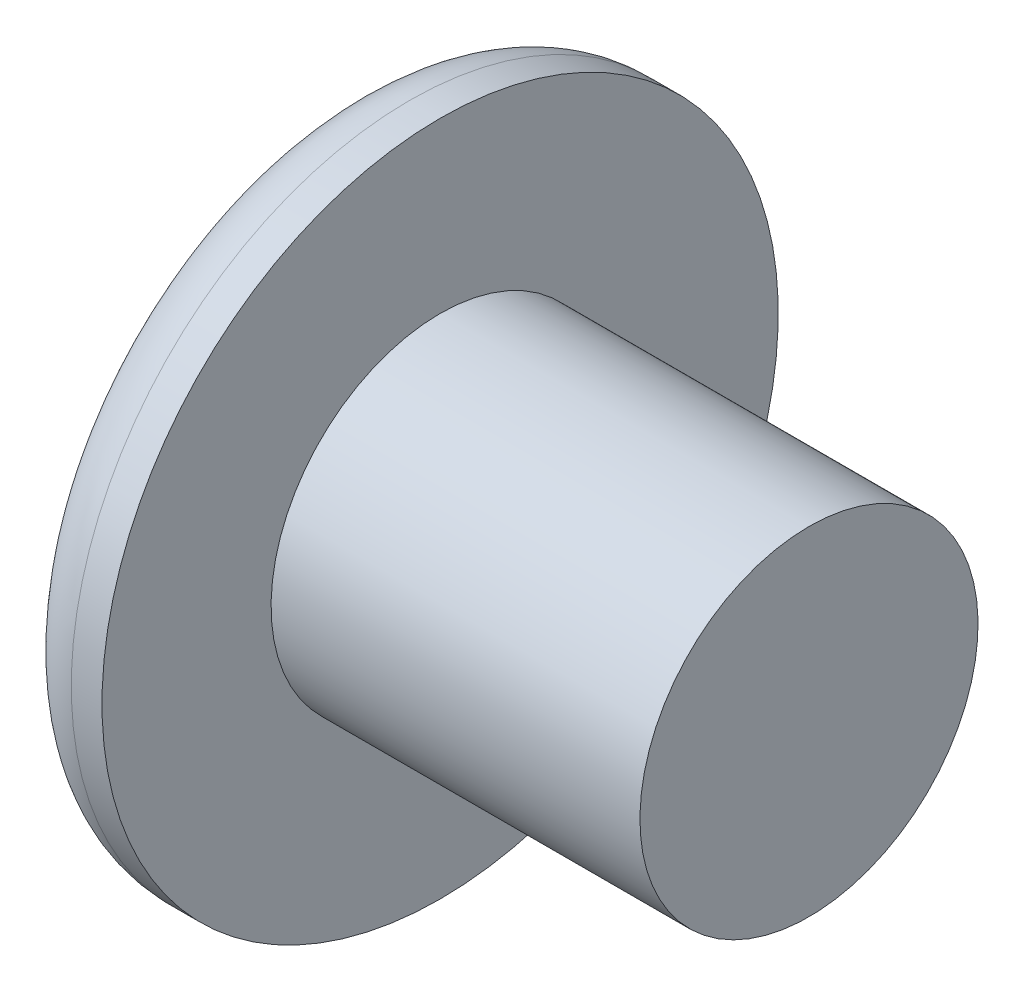
ISO-10303-21;
HEADER;
FILE_DESCRIPTION(('STEP AP214'),'2;1');
FILE_NAME('part.step','',(''),(''),'','','');
FILE_SCHEMA(('AUTOMOTIVE_DESIGN { 1 0 10303 214 1 1 1 1 }'));
ENDSEC;
DATA;
#1=APPLICATION_CONTEXT('core data for automotive mechanical design processes');
#2=APPLICATION_PROTOCOL_DEFINITION('international standard','automotive_design',2000,#1);
#3=PRODUCT_CONTEXT('',#1,'mechanical');
#4=PRODUCT('Part','Part','',(#3));
#5=PRODUCT_RELATED_PRODUCT_CATEGORY('part','',(#4));
#6=PRODUCT_DEFINITION_FORMATION('','',#4);
#7=PRODUCT_DEFINITION_CONTEXT('part definition',#1,'design');
#8=PRODUCT_DEFINITION('design','',#6,#7);
#9=PRODUCT_DEFINITION_SHAPE('','',#8);
#10=(LENGTH_UNIT() NAMED_UNIT(*) SI_UNIT(.MILLI.,.METRE.));
#11=(NAMED_UNIT(*) PLANE_ANGLE_UNIT() SI_UNIT($,.RADIAN.));
#12=(NAMED_UNIT(*) SI_UNIT($,.STERADIAN.) SOLID_ANGLE_UNIT());
#13=UNCERTAINTY_MEASURE_WITH_UNIT(LENGTH_MEASURE(1.E-05),#10,'distance_accuracy_value','');
#14=(GEOMETRIC_REPRESENTATION_CONTEXT(3) GLOBAL_UNCERTAINTY_ASSIGNED_CONTEXT((#13)) GLOBAL_UNIT_ASSIGNED_CONTEXT((#10,
#11,#12)) REPRESENTATION_CONTEXT('',''));
#15=CARTESIAN_POINT('',(0.,0.,0.));
#16=DIRECTION('',(0.,0.,1.));
#17=DIRECTION('',(1.,0.,0.));
#18=AXIS2_PLACEMENT_3D('',#15,#16,#17);
#19=CARTESIAN_POINT('',(15.,0.,0.));
#20=DIRECTION('',(-1.,0.,0.));
#21=DIRECTION('',(0.,-1.,0.));
#22=AXIS2_PLACEMENT_3D('',#19,#20,#21);
#23=PLANE('',#22);
#24=CARTESIAN_POINT('',(15.,0.,0.));
#25=DIRECTION('',(1.,0.,0.));
#26=DIRECTION('',(0.,1.,0.));
#27=AXIS2_PLACEMENT_3D('',#24,#25,#26);
#28=CIRCLE('',#27,5.5);
#29=CARTESIAN_POINT('',(15.,5.5,0.));
#30=VERTEX_POINT('',#29);
#31=EDGE_CURVE('E52',#30,#30,#28,.T.);
#32=ORIENTED_EDGE('',*,*,#31,.T.);
#33=EDGE_LOOP('',(#32));
#34=FACE_BOUND('',#33,.T.);
#35=ADVANCED_FACE('F39',(#34),#23,.F.);
#36=CARTESIAN_POINT('',(15.,0.,0.));
#37=DIRECTION('',(1.,0.,0.));
#38=DIRECTION('',(0.,1.,0.));
#39=AXIS2_PLACEMENT_3D('',#36,#37,#38);
#40=CYLINDRICAL_SURFACE('',#39,5.5);
#41=ORIENTED_EDGE('',*,*,#31,.F.);
#42=EDGE_LOOP('',(#41));
#43=FACE_BOUND('',#42,.T.);
#44=CARTESIAN_POINT('',(3.,0.,0.));
#45=DIRECTION('',(1.,0.,0.));
#46=DIRECTION('',(0.,1.,0.));
#47=AXIS2_PLACEMENT_3D('',#44,#45,#46);
#48=CIRCLE('',#47,5.5);
#49=CARTESIAN_POINT('',(3.,5.5,0.));
#50=VERTEX_POINT('',#49);
#51=EDGE_CURVE('E57',#50,#50,#48,.T.);
#52=ORIENTED_EDGE('',*,*,#51,.T.);
#53=EDGE_LOOP('',(#52));
#54=FACE_BOUND('',#53,.T.);
#55=ADVANCED_FACE('F79',(#43,#54),#40,.T.);
#56=CARTESIAN_POINT('',(3.,0.,0.));
#57=DIRECTION('',(-1.,0.,0.));
#58=DIRECTION('',(0.,-1.,0.));
#59=AXIS2_PLACEMENT_3D('',#56,#57,#58);
#60=PLANE('',#59);
#61=ORIENTED_EDGE('',*,*,#51,.F.);
#62=EDGE_LOOP('',(#61));
#63=FACE_BOUND('',#62,.T.);
#64=CARTESIAN_POINT('',(3.,0.,0.));
#65=DIRECTION('',(1.,0.,0.));
#66=DIRECTION('',(0.,1.,0.));
#67=AXIS2_PLACEMENT_3D('',#64,#65,#66);
#68=CIRCLE('',#67,11.);
#69=CARTESIAN_POINT('',(3.,11.,0.));
#70=VERTEX_POINT('',#69);
#71=EDGE_CURVE('E63',#70,#70,#68,.T.);
#72=ORIENTED_EDGE('',*,*,#71,.T.);
#73=EDGE_LOOP('',(#72));
#74=FACE_BOUND('',#73,.T.);
#75=ADVANCED_FACE('F68',(#63,#74),#60,.F.);
#76=CARTESIAN_POINT('',(15.,0.,0.));
#77=DIRECTION('',(1.,0.,0.));
#78=DIRECTION('',(0.,1.,0.));
#79=AXIS2_PLACEMENT_3D('',#76,#77,#78);
#80=CYLINDRICAL_SURFACE('',#79,11.);
#81=CARTESIAN_POINT('',(2.,0.,0.));
#82=DIRECTION('',(1.,0.,0.));
#83=DIRECTION('',(0.,1.,0.));
#84=AXIS2_PLACEMENT_3D('',#81,#82,#83);
#85=CIRCLE('',#84,11.);
#86=CARTESIAN_POINT('',(2.,11.,0.));
#87=VERTEX_POINT('',#86);
#88=EDGE_CURVE('E47',#87,#87,#85,.T.);
#89=ORIENTED_EDGE('',*,*,#88,.T.);
#90=EDGE_LOOP('',(#89));
#91=FACE_BOUND('',#90,.T.);
#92=ORIENTED_EDGE('',*,*,#71,.F.);
#93=EDGE_LOOP('',(#92));
#94=FACE_BOUND('',#93,.T.);
#95=ADVANCED_FACE('F70',(#91,#94),#80,.T.);
#96=CARTESIAN_POINT('',(0.,0.,0.));
#97=DIRECTION('',(1.,0.,0.));
#98=DIRECTION('',(0.,1.,0.));
#99=AXIS2_PLACEMENT_3D('',#96,#97,#98);
#100=PLANE('',#99);
#101=CARTESIAN_POINT('',(0.,0.,0.));
#102=DIRECTION('',(1.,0.,0.));
#103=DIRECTION('',(0.,1.,0.));
#104=AXIS2_PLACEMENT_3D('',#101,#102,#103);
#105=CIRCLE('',#104,9.);
#106=CARTESIAN_POINT('',(0.,9.,0.));
#107=VERTEX_POINT('',#106);
#108=EDGE_CURVE('E10',#107,#107,#105,.F.);
#109=ORIENTED_EDGE('',*,*,#108,.T.);
#110=EDGE_LOOP('',(#109));
#111=FACE_BOUND('',#110,.T.);
#112=ADVANCED_FACE('F72',(#111),#100,.F.);
#113=CARTESIAN_POINT('',(2.,0.,0.));
#114=DIRECTION('',(1.,0.,0.));
#115=DIRECTION('',(0.,1.,0.));
#116=AXIS2_PLACEMENT_3D('',#113,#114,#115);
#117=TOROIDAL_SURFACE('',#116,9.,2.);
#118=ORIENTED_EDGE('',*,*,#108,.F.);
#119=EDGE_LOOP('',(#118));
#120=FACE_BOUND('',#119,.T.);
#121=ORIENTED_EDGE('',*,*,#88,.F.);
#122=EDGE_LOOP('',(#121));
#123=FACE_BOUND('',#122,.T.);
#124=ADVANCED_FACE('F41',(#120,#123),#117,.T.);
#125=CLOSED_SHELL('',(#35,#55,#75,#95,#112,#124));
#126=MANIFOLD_SOLID_BREP('B2',#125);
#127=ADVANCED_BREP_SHAPE_REPRESENTATION('',(#18,#126),#14);
#128=SHAPE_DEFINITION_REPRESENTATION(#9,#127);
ENDSEC;
END-ISO-10303-21;
